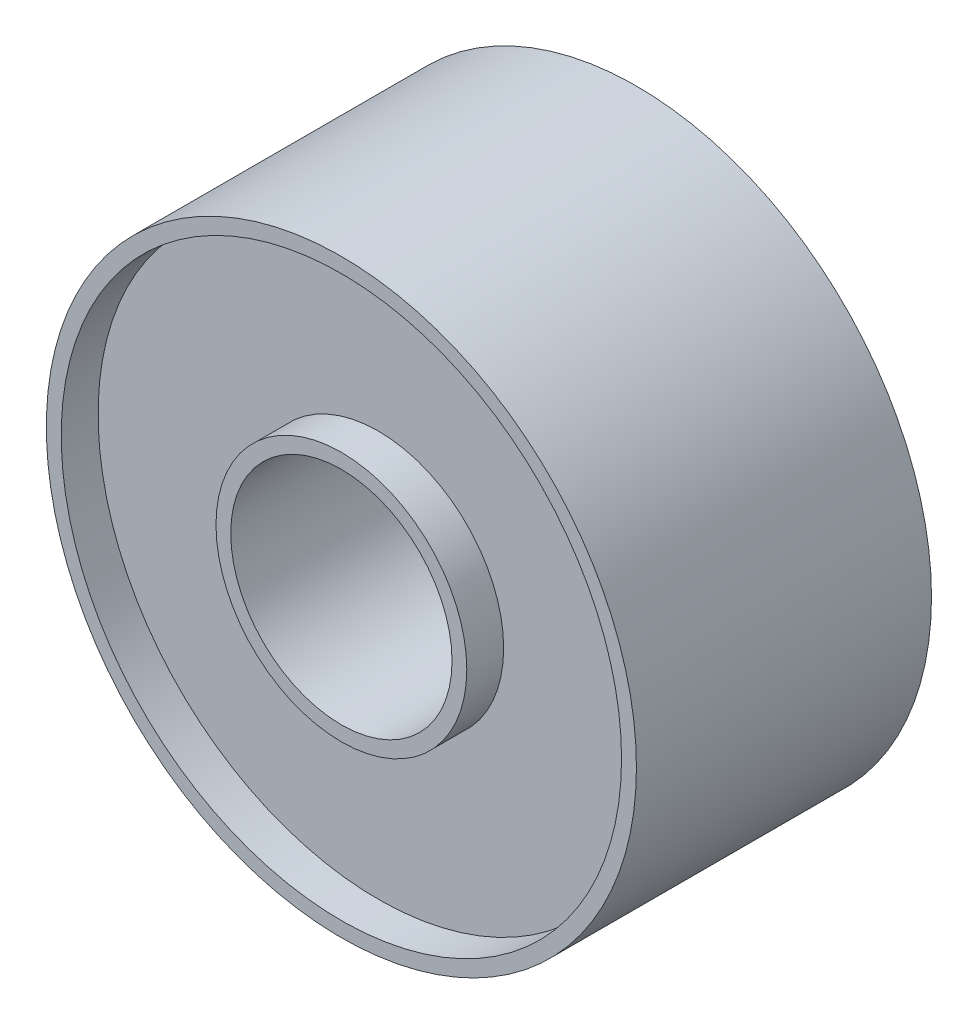
ISO-10303-21;
HEADER;
FILE_DESCRIPTION(('STEP AP214'),'2;1');
FILE_NAME('part.step','',(''),(''),'','','');
FILE_SCHEMA(('AUTOMOTIVE_DESIGN { 1 0 10303 214 1 1 1 1 }'));
ENDSEC;
DATA;
#1=APPLICATION_CONTEXT('core data for automotive mechanical design processes');
#2=APPLICATION_PROTOCOL_DEFINITION('international standard','automotive_design',2000,#1);
#3=PRODUCT_CONTEXT('',#1,'mechanical');
#4=PRODUCT('Part','Part','',(#3));
#5=PRODUCT_RELATED_PRODUCT_CATEGORY('part','',(#4));
#6=PRODUCT_DEFINITION_FORMATION('','',#4);
#7=PRODUCT_DEFINITION_CONTEXT('part definition',#1,'design');
#8=PRODUCT_DEFINITION('design','',#6,#7);
#9=PRODUCT_DEFINITION_SHAPE('','',#8);
#10=(LENGTH_UNIT() NAMED_UNIT(*) SI_UNIT(.MILLI.,.METRE.));
#11=(NAMED_UNIT(*) PLANE_ANGLE_UNIT() SI_UNIT($,.RADIAN.));
#12=(NAMED_UNIT(*) SI_UNIT($,.STERADIAN.) SOLID_ANGLE_UNIT());
#13=UNCERTAINTY_MEASURE_WITH_UNIT(LENGTH_MEASURE(1.E-05),#10,'distance_accuracy_value','');
#14=(GEOMETRIC_REPRESENTATION_CONTEXT(3) GLOBAL_UNCERTAINTY_ASSIGNED_CONTEXT((#13)) GLOBAL_UNIT_ASSIGNED_CONTEXT((#10,
#11,#12)) REPRESENTATION_CONTEXT('',''));
#15=CARTESIAN_POINT('',(0.,0.,0.));
#16=DIRECTION('',(0.,0.,1.));
#17=DIRECTION('',(1.,0.,0.));
#18=AXIS2_PLACEMENT_3D('',#15,#16,#17);
#19=CARTESIAN_POINT('',(0.,0.,0.));
#20=DIRECTION('',(0.,0.,1.));
#21=DIRECTION('',(1.,0.,0.));
#22=AXIS2_PLACEMENT_3D('',#19,#20,#21);
#23=PLANE('',#22);
#24=CARTESIAN_POINT('',(0.,0.,0.));
#25=DIRECTION('',(0.,0.,1.));
#26=DIRECTION('',(1.,0.,0.));
#27=AXIS2_PLACEMENT_3D('',#24,#25,#26);
#28=CIRCLE('',#27,1.5);
#29=CARTESIAN_POINT('',(1.5,0.,0.));
#30=VERTEX_POINT('',#29);
#31=EDGE_CURVE('E43',#30,#30,#28,.T.);
#32=ORIENTED_EDGE('',*,*,#31,.T.);
#33=EDGE_LOOP('',(#32));
#34=FACE_BOUND('',#33,.T.);
#35=CARTESIAN_POINT('',(0.,0.,0.));
#36=DIRECTION('',(0.,0.,-1.));
#37=DIRECTION('',(-1.,0.,0.));
#38=AXIS2_PLACEMENT_3D('',#35,#36,#37);
#39=CIRCLE('',#38,1.7);
#40=CARTESIAN_POINT('',(-1.7,0.,0.));
#41=VERTEX_POINT('',#40);
#42=EDGE_CURVE('E67',#41,#41,#39,.T.);
#43=ORIENTED_EDGE('',*,*,#42,.T.);
#44=EDGE_LOOP('',(#43));
#45=FACE_BOUND('',#44,.T.);
#46=ADVANCED_FACE('F30',(#34,#45),#23,.F.);
#47=CARTESIAN_POINT('',(0.,0.,4.));
#48=DIRECTION('',(0.,0.,1.));
#49=DIRECTION('',(1.,0.,0.));
#50=AXIS2_PLACEMENT_3D('',#47,#48,#49);
#51=PLANE('',#50);
#52=CARTESIAN_POINT('',(0.,0.,4.));
#53=DIRECTION('',(0.,0.,1.));
#54=DIRECTION('',(1.,0.,0.));
#55=AXIS2_PLACEMENT_3D('',#52,#53,#54);
#56=CIRCLE('',#55,1.5);
#57=CARTESIAN_POINT('',(1.5,0.,4.));
#58=VERTEX_POINT('',#57);
#59=EDGE_CURVE('E41',#58,#58,#56,.T.);
#60=ORIENTED_EDGE('',*,*,#59,.F.);
#61=EDGE_LOOP('',(#60));
#62=FACE_BOUND('',#61,.T.);
#63=CARTESIAN_POINT('',(0.,0.,4.));
#64=DIRECTION('',(0.,0.,1.));
#65=DIRECTION('',(1.,0.,0.));
#66=AXIS2_PLACEMENT_3D('',#63,#64,#65);
#67=CIRCLE('',#66,1.7);
#68=CARTESIAN_POINT('',(1.7,0.,4.));
#69=VERTEX_POINT('',#68);
#70=EDGE_CURVE('E55',#69,#69,#67,.T.);
#71=ORIENTED_EDGE('',*,*,#70,.T.);
#72=EDGE_LOOP('',(#71));
#73=FACE_BOUND('',#72,.T.);
#74=ADVANCED_FACE('F105',(#62,#73),#51,.T.);
#75=CARTESIAN_POINT('',(0.,0.,4.));
#76=DIRECTION('',(0.,0.,1.));
#77=DIRECTION('',(1.,0.,0.));
#78=AXIS2_PLACEMENT_3D('',#75,#76,#77);
#79=CIRCLE('',#78,3.79820702805241);
#80=CARTESIAN_POINT('',(3.79820702805241,0.,4.));
#81=VERTEX_POINT('',#80);
#82=EDGE_CURVE('E49',#81,#81,#79,.T.);
#83=ORIENTED_EDGE('',*,*,#82,.F.);
#84=EDGE_LOOP('',(#83));
#85=FACE_BOUND('',#84,.T.);
#86=CARTESIAN_POINT('',(0.,0.,4.));
#87=DIRECTION('',(0.,0.,1.));
#88=DIRECTION('',(1.,0.,0.));
#89=AXIS2_PLACEMENT_3D('',#86,#87,#88);
#90=CIRCLE('',#89,4.);
#91=CARTESIAN_POINT('',(4.,0.,4.));
#92=VERTEX_POINT('',#91);
#93=EDGE_CURVE('E10',#92,#92,#90,.T.);
#94=ORIENTED_EDGE('',*,*,#93,.T.);
#95=EDGE_LOOP('',(#94));
#96=FACE_BOUND('',#95,.T.);
#97=ADVANCED_FACE('F92',(#85,#96),#51,.T.);
#98=CARTESIAN_POINT('',(0.,0.,0.));
#99=DIRECTION('',(0.,0.,-1.));
#100=DIRECTION('',(-1.,0.,0.));
#101=AXIS2_PLACEMENT_3D('',#98,#99,#100);
#102=CIRCLE('',#101,3.79820702805241);
#103=CARTESIAN_POINT('',(-3.79820702805241,0.,0.));
#104=VERTEX_POINT('',#103);
#105=EDGE_CURVE('E61',#104,#104,#102,.T.);
#106=ORIENTED_EDGE('',*,*,#105,.F.);
#107=EDGE_LOOP('',(#106));
#108=FACE_BOUND('',#107,.T.);
#109=CARTESIAN_POINT('',(0.,0.,0.));
#110=DIRECTION('',(0.,0.,1.));
#111=DIRECTION('',(1.,0.,0.));
#112=AXIS2_PLACEMENT_3D('',#109,#110,#111);
#113=CIRCLE('',#112,4.);
#114=CARTESIAN_POINT('',(4.,0.,0.));
#115=VERTEX_POINT('',#114);
#116=EDGE_CURVE('E34',#115,#115,#113,.T.);
#117=ORIENTED_EDGE('',*,*,#116,.F.);
#118=EDGE_LOOP('',(#117));
#119=FACE_BOUND('',#118,.T.);
#120=ADVANCED_FACE('F89',(#108,#119),#23,.F.);
#121=CARTESIAN_POINT('',(0.,0.,4.));
#122=DIRECTION('',(0.,0.,-1.));
#123=DIRECTION('',(-1.,0.,0.));
#124=AXIS2_PLACEMENT_3D('',#121,#122,#123);
#125=CYLINDRICAL_SURFACE('',#124,4.);
#126=ORIENTED_EDGE('',*,*,#93,.F.);
#127=EDGE_LOOP('',(#126));
#128=FACE_BOUND('',#127,.T.);
#129=ORIENTED_EDGE('',*,*,#116,.T.);
#130=EDGE_LOOP('',(#129));
#131=FACE_BOUND('',#130,.T.);
#132=ADVANCED_FACE('F32',(#128,#131),#125,.T.);
#133=CARTESIAN_POINT('',(0.,0.,4.));
#134=DIRECTION('',(0.,0.,-1.));
#135=DIRECTION('',(-1.,0.,0.));
#136=AXIS2_PLACEMENT_3D('',#133,#134,#135);
#137=CYLINDRICAL_SURFACE('',#136,1.5);
#138=ORIENTED_EDGE('',*,*,#59,.T.);
#139=EDGE_LOOP('',(#138));
#140=FACE_BOUND('',#139,.T.);
#141=ORIENTED_EDGE('',*,*,#31,.F.);
#142=EDGE_LOOP('',(#141));
#143=FACE_BOUND('',#142,.T.);
#144=ADVANCED_FACE('F96',(#140,#143),#137,.F.);
#145=CARTESIAN_POINT('',(0.,0.,3.5));
#146=DIRECTION('',(0.,0.,1.));
#147=DIRECTION('',(1.,0.,0.));
#148=AXIS2_PLACEMENT_3D('',#145,#146,#147);
#149=CYLINDRICAL_SURFACE('',#148,3.79820702805241);
#150=CARTESIAN_POINT('',(0.,0.,3.5));
#151=DIRECTION('',(0.,0.,1.));
#152=DIRECTION('',(1.,0.,0.));
#153=AXIS2_PLACEMENT_3D('',#150,#151,#152);
#154=CIRCLE('',#153,3.79820702805241);
#155=CARTESIAN_POINT('',(3.79820702805241,0.,3.5));
#156=VERTEX_POINT('',#155);
#157=EDGE_CURVE('E46',#156,#156,#154,.T.);
#158=ORIENTED_EDGE('',*,*,#157,.F.);
#159=EDGE_LOOP('',(#158));
#160=FACE_BOUND('',#159,.T.);
#161=ORIENTED_EDGE('',*,*,#82,.T.);
#162=EDGE_LOOP('',(#161));
#163=FACE_BOUND('',#162,.T.);
#164=ADVANCED_FACE('F101',(#160,#163),#149,.F.);
#165=CARTESIAN_POINT('',(0.,0.,3.5));
#166=DIRECTION('',(0.,0.,1.));
#167=DIRECTION('',(1.,0.,0.));
#168=AXIS2_PLACEMENT_3D('',#165,#166,#167);
#169=PLANE('',#168);
#170=CARTESIAN_POINT('',(0.,0.,3.5));
#171=DIRECTION('',(0.,0.,1.));
#172=DIRECTION('',(1.,0.,0.));
#173=AXIS2_PLACEMENT_3D('',#170,#171,#172);
#174=CIRCLE('',#173,1.7);
#175=CARTESIAN_POINT('',(1.7,0.,3.5));
#176=VERTEX_POINT('',#175);
#177=EDGE_CURVE('E52',#176,#176,#174,.T.);
#178=ORIENTED_EDGE('',*,*,#177,.F.);
#179=EDGE_LOOP('',(#178));
#180=FACE_BOUND('',#179,.T.);
#181=ORIENTED_EDGE('',*,*,#157,.T.);
#182=EDGE_LOOP('',(#181));
#183=FACE_BOUND('',#182,.T.);
#184=ADVANCED_FACE('F118',(#180,#183),#169,.T.);
#185=CARTESIAN_POINT('',(0.,0.,3.5));
#186=DIRECTION('',(0.,0.,1.));
#187=DIRECTION('',(1.,0.,0.));
#188=AXIS2_PLACEMENT_3D('',#185,#186,#187);
#189=CYLINDRICAL_SURFACE('',#188,1.7);
#190=ORIENTED_EDGE('',*,*,#177,.T.);
#191=EDGE_LOOP('',(#190));
#192=FACE_BOUND('',#191,.T.);
#193=ORIENTED_EDGE('',*,*,#70,.F.);
#194=EDGE_LOOP('',(#193));
#195=FACE_BOUND('',#194,.T.);
#196=ADVANCED_FACE('F85',(#192,#195),#189,.T.);
#197=CARTESIAN_POINT('',(0.,0.,0.5));
#198=DIRECTION('',(0.,0.,-1.));
#199=DIRECTION('',(-1.,0.,0.));
#200=AXIS2_PLACEMENT_3D('',#197,#198,#199);
#201=CYLINDRICAL_SURFACE('',#200,3.79820702805241);
#202=CARTESIAN_POINT('',(0.,0.,0.5));
#203=DIRECTION('',(0.,0.,-1.));
#204=DIRECTION('',(-1.,0.,0.));
#205=AXIS2_PLACEMENT_3D('',#202,#203,#204);
#206=CIRCLE('',#205,3.79820702805241);
#207=CARTESIAN_POINT('',(-3.79820702805241,0.,0.5));
#208=VERTEX_POINT('',#207);
#209=EDGE_CURVE('E58',#208,#208,#206,.T.);
#210=ORIENTED_EDGE('',*,*,#209,.F.);
#211=EDGE_LOOP('',(#210));
#212=FACE_BOUND('',#211,.T.);
#213=ORIENTED_EDGE('',*,*,#105,.T.);
#214=EDGE_LOOP('',(#213));
#215=FACE_BOUND('',#214,.T.);
#216=ADVANCED_FACE('F79',(#212,#215),#201,.F.);
#217=CARTESIAN_POINT('',(0.,0.,0.5));
#218=DIRECTION('',(0.,0.,-1.));
#219=DIRECTION('',(-1.,0.,0.));
#220=AXIS2_PLACEMENT_3D('',#217,#218,#219);
#221=PLANE('',#220);
#222=CARTESIAN_POINT('',(0.,0.,0.5));
#223=DIRECTION('',(0.,0.,-1.));
#224=DIRECTION('',(-1.,0.,0.));
#225=AXIS2_PLACEMENT_3D('',#222,#223,#224);
#226=CIRCLE('',#225,1.7);
#227=CARTESIAN_POINT('',(-1.7,0.,0.5));
#228=VERTEX_POINT('',#227);
#229=EDGE_CURVE('E64',#228,#228,#226,.T.);
#230=ORIENTED_EDGE('',*,*,#229,.F.);
#231=EDGE_LOOP('',(#230));
#232=FACE_BOUND('',#231,.T.);
#233=ORIENTED_EDGE('',*,*,#209,.T.);
#234=EDGE_LOOP('',(#233));
#235=FACE_BOUND('',#234,.T.);
#236=ADVANCED_FACE('F76',(#232,#235),#221,.T.);
#237=CARTESIAN_POINT('',(0.,0.,0.5));
#238=DIRECTION('',(0.,0.,-1.));
#239=DIRECTION('',(-1.,0.,0.));
#240=AXIS2_PLACEMENT_3D('',#237,#238,#239);
#241=CYLINDRICAL_SURFACE('',#240,1.7);
#242=ORIENTED_EDGE('',*,*,#229,.T.);
#243=EDGE_LOOP('',(#242));
#244=FACE_BOUND('',#243,.T.);
#245=ORIENTED_EDGE('',*,*,#42,.F.);
#246=EDGE_LOOP('',(#245));
#247=FACE_BOUND('',#246,.T.);
#248=ADVANCED_FACE('F73',(#244,#247),#241,.T.);
#249=CLOSED_SHELL('',(#46,#74,#97,#120,#132,#144,#164,#184,#196,#216,#236,#248));
#250=MANIFOLD_SOLID_BREP('B2',#249);
#251=ADVANCED_BREP_SHAPE_REPRESENTATION('',(#18,#250),#14);
#252=SHAPE_DEFINITION_REPRESENTATION(#9,#251);
ENDSEC;
END-ISO-10303-21;
